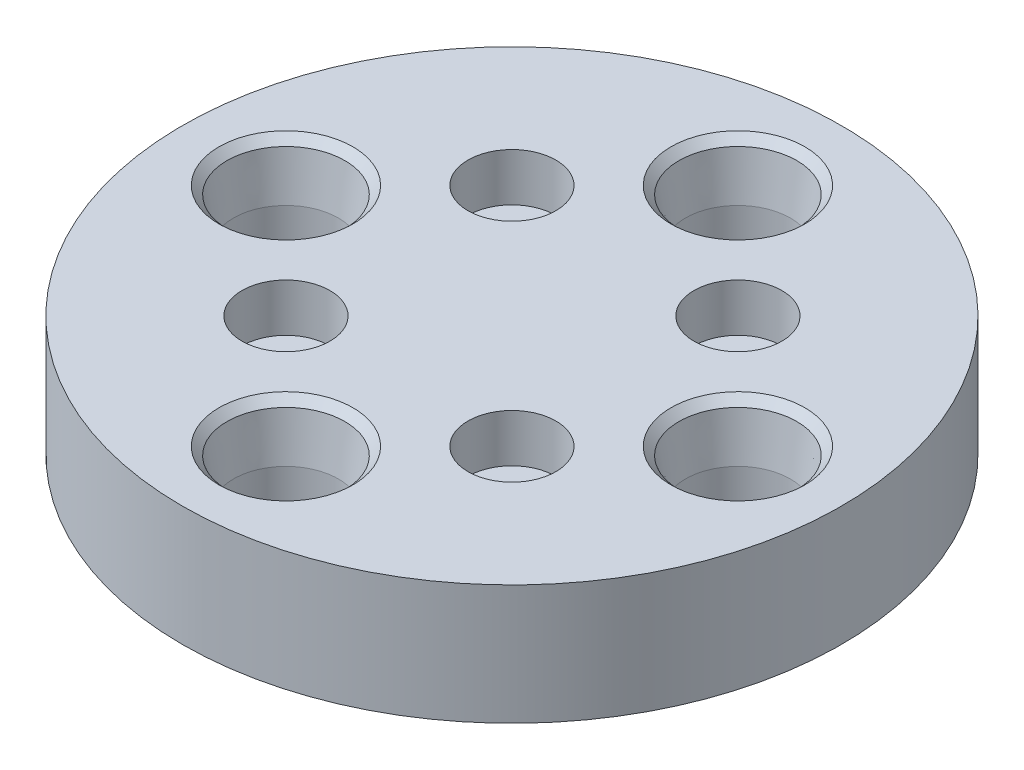
ISO-10303-21;
HEADER;
FILE_DESCRIPTION(('STEP AP214'),'2;1');
FILE_NAME('part.step','',(''),(''),'','','');
FILE_SCHEMA(('AUTOMOTIVE_DESIGN { 1 0 10303 214 1 1 1 1 }'));
ENDSEC;
DATA;
#1=APPLICATION_CONTEXT('core data for automotive mechanical design processes');
#2=APPLICATION_PROTOCOL_DEFINITION('international standard','automotive_design',2000,#1);
#3=PRODUCT_CONTEXT('',#1,'mechanical');
#4=PRODUCT('Part','Part','',(#3));
#5=PRODUCT_RELATED_PRODUCT_CATEGORY('part','',(#4));
#6=PRODUCT_DEFINITION_FORMATION('','',#4);
#7=PRODUCT_DEFINITION_CONTEXT('part definition',#1,'design');
#8=PRODUCT_DEFINITION('design','',#6,#7);
#9=PRODUCT_DEFINITION_SHAPE('','',#8);
#10=(LENGTH_UNIT() NAMED_UNIT(*) SI_UNIT(.MILLI.,.METRE.));
#11=(NAMED_UNIT(*) PLANE_ANGLE_UNIT() SI_UNIT($,.RADIAN.));
#12=(NAMED_UNIT(*) SI_UNIT($,.STERADIAN.) SOLID_ANGLE_UNIT());
#13=UNCERTAINTY_MEASURE_WITH_UNIT(LENGTH_MEASURE(1.E-05),#10,'distance_accuracy_value','');
#14=(GEOMETRIC_REPRESENTATION_CONTEXT(3) GLOBAL_UNCERTAINTY_ASSIGNED_CONTEXT((#13)) GLOBAL_UNIT_ASSIGNED_CONTEXT((#10,
#11,#12)) REPRESENTATION_CONTEXT('',''));
#15=CARTESIAN_POINT('',(0.,0.,0.));
#16=DIRECTION('',(0.,0.,1.));
#17=DIRECTION('',(1.,0.,0.));
#18=AXIS2_PLACEMENT_3D('',#15,#16,#17);
#19=CARTESIAN_POINT('',(0.,-8.,0.));
#20=DIRECTION('',(0.,-1.,0.));
#21=DIRECTION('',(0.,0.,-1.));
#22=AXIS2_PLACEMENT_3D('',#19,#20,#21);
#23=PLANE('',#22);
#24=CARTESIAN_POINT('',(0.,-8.,0.));
#25=DIRECTION('',(0.,-1.,0.));
#26=DIRECTION('',(0.,0.,-1.));
#27=AXIS2_PLACEMENT_3D('',#24,#25,#26);
#28=CIRCLE('',#27,4.5);
#29=CARTESIAN_POINT('',(0.,-8.,-4.5));
#30=VERTEX_POINT('',#29);
#31=EDGE_CURVE('E336',#30,#30,#28,.T.);
#32=ORIENTED_EDGE('',*,*,#31,.F.);
#33=EDGE_LOOP('',(#32));
#34=FACE_BOUND('',#33,.T.);
#35=CARTESIAN_POINT('',(5.65685424949243,-8.,5.65685424949233));
#36=DIRECTION('',(0.,1.,0.));
#37=DIRECTION('',(0.,0.,1.));
#38=AXIS2_PLACEMENT_3D('',#35,#36,#37);
#39=CIRCLE('',#38,1.2);
#40=CARTESIAN_POINT('',(5.65685424949243,-8.,6.85685424949233));
#41=VERTEX_POINT('',#40);
#42=EDGE_CURVE('E319',#41,#41,#39,.T.);
#43=ORIENTED_EDGE('',*,*,#42,.T.);
#44=EDGE_LOOP('',(#43));
#45=FACE_BOUND('',#44,.T.);
#46=CARTESIAN_POINT('',(5.65685424949239,-8.,-5.65685424949237));
#47=DIRECTION('',(0.,1.,0.));
#48=DIRECTION('',(0.,0.,1.));
#49=AXIS2_PLACEMENT_3D('',#46,#47,#48);
#50=CIRCLE('',#49,1.2);
#51=CARTESIAN_POINT('',(5.65685424949239,-8.,-4.45685424949237));
#52=VERTEX_POINT('',#51);
#53=EDGE_CURVE('E187',#52,#52,#50,.T.);
#54=ORIENTED_EDGE('',*,*,#53,.T.);
#55=EDGE_LOOP('',(#54));
#56=FACE_BOUND('',#55,.T.);
#57=CARTESIAN_POINT('',(-11.3137084989848,-8.,0.));
#58=DIRECTION('',(0.,-1.,0.));
#59=DIRECTION('',(0.,0.,-1.));
#60=AXIS2_PLACEMENT_3D('',#57,#58,#59);
#61=CIRCLE('',#60,2.25);
#62=CARTESIAN_POINT('',(-10.0762716319083,-8.,-1.87916204729658));
#63=VERTEX_POINT('',#62);
#64=CARTESIAN_POINT('',(-10.0762716319083,-8.,1.87916204729665));
#65=VERTEX_POINT('',#64);
#66=EDGE_CURVE('E11',#63,#65,#61,.T.);
#67=ORIENTED_EDGE('',*,*,#66,.F.);
#68=CARTESIAN_POINT('',(0.,-8.,0.));
#69=DIRECTION('',(0.,-1.,0.));
#70=DIRECTION('',(0.,0.,-1.));
#71=AXIS2_PLACEMENT_3D('',#68,#69,#70);
#72=CIRCLE('',#71,10.25);
#73=CARTESIAN_POINT('',(-1.87916204729661,-8.,-10.0762716319083));
#74=VERTEX_POINT('',#73);
#75=EDGE_CURVE('E141',#63,#74,#72,.T.);
#76=ORIENTED_EDGE('',*,*,#75,.T.);
#77=CARTESIAN_POINT('',(0.,-8.,-11.3137084989848));
#78=DIRECTION('',(0.,-1.,0.));
#79=DIRECTION('',(0.,0.,-1.));
#80=AXIS2_PLACEMENT_3D('',#77,#78,#79);
#81=CIRCLE('',#80,2.25);
#82=CARTESIAN_POINT('',(1.87916204729661,-8.,-10.0762716319083));
#83=VERTEX_POINT('',#82);
#84=EDGE_CURVE('E121',#83,#74,#81,.T.);
#85=ORIENTED_EDGE('',*,*,#84,.F.);
#86=CARTESIAN_POINT('',(10.0762716319083,-8.,-1.87916204729672));
#87=VERTEX_POINT('',#86);
#88=EDGE_CURVE('E128',#83,#87,#72,.T.);
#89=ORIENTED_EDGE('',*,*,#88,.T.);
#90=CARTESIAN_POINT('',(11.3137084989848,-8.,-1.18504806291949E-13));
#91=DIRECTION('',(0.,-1.,0.));
#92=DIRECTION('',(0.,0.,-1.));
#93=AXIS2_PLACEMENT_3D('',#90,#91,#92);
#94=CIRCLE('',#93,2.25);
#95=CARTESIAN_POINT('',(10.0762716319083,-8.,1.87916204729651));
#96=VERTEX_POINT('',#95);
#97=EDGE_CURVE('E109',#96,#87,#94,.T.);
#98=ORIENTED_EDGE('',*,*,#97,.F.);
#99=CARTESIAN_POINT('',(1.87916204729661,-8.,10.0762716319083));
#100=VERTEX_POINT('',#99);
#101=EDGE_CURVE('E139',#96,#100,#72,.T.);
#102=ORIENTED_EDGE('',*,*,#101,.T.);
#103=CARTESIAN_POINT('',(0.,-8.,11.3137084989848));
#104=DIRECTION('',(0.,-1.,0.));
#105=DIRECTION('',(0.,0.,-1.));
#106=AXIS2_PLACEMENT_3D('',#103,#104,#105);
#107=CIRCLE('',#106,2.25);
#108=CARTESIAN_POINT('',(-1.87916204729661,-8.,10.0762716319083));
#109=VERTEX_POINT('',#108);
#110=EDGE_CURVE('E54',#109,#100,#107,.T.);
#111=ORIENTED_EDGE('',*,*,#110,.F.);
#112=EDGE_CURVE('E147',#109,#65,#72,.T.);
#113=ORIENTED_EDGE('',*,*,#112,.T.);
#114=EDGE_LOOP('',(#67,#76,#85,#89,#98,#102,#111,#113));
#115=FACE_BOUND('',#114,.T.);
#116=CARTESIAN_POINT('',(-5.65685424949239,-8.,-5.65685424949237));
#117=DIRECTION('',(0.,1.,0.));
#118=DIRECTION('',(0.,0.,1.));
#119=AXIS2_PLACEMENT_3D('',#116,#117,#118);
#120=CIRCLE('',#119,1.2);
#121=CARTESIAN_POINT('',(-5.65685424949239,-8.,-4.45685424949237));
#122=VERTEX_POINT('',#121);
#123=EDGE_CURVE('E287',#122,#122,#120,.T.);
#124=ORIENTED_EDGE('',*,*,#123,.T.);
#125=EDGE_LOOP('',(#124));
#126=FACE_BOUND('',#125,.T.);
#127=CARTESIAN_POINT('',(-5.65685424949239,-8.,5.65685424949237));
#128=DIRECTION('',(0.,1.,0.));
#129=DIRECTION('',(0.,0.,1.));
#130=AXIS2_PLACEMENT_3D('',#127,#128,#129);
#131=CIRCLE('',#130,1.2);
#132=CARTESIAN_POINT('',(-5.65685424949239,-8.,6.85685424949237));
#133=VERTEX_POINT('',#132);
#134=EDGE_CURVE('E303',#133,#133,#131,.T.);
#135=ORIENTED_EDGE('',*,*,#134,.T.);
#136=EDGE_LOOP('',(#135));
#137=FACE_BOUND('',#136,.T.);
#138=ADVANCED_FACE('F45',(#34,#45,#56,#115,#126,#137),#23,.T.);
#139=CARTESIAN_POINT('',(0.,-8.,0.));
#140=DIRECTION('',(0.,1.,0.));
#141=DIRECTION('',(0.,0.,1.));
#142=AXIS2_PLACEMENT_3D('',#139,#140,#141);
#143=CYLINDRICAL_SURFACE('',#142,10.25);
#144=CARTESIAN_POINT('',(0.,-6.,0.));
#145=DIRECTION('',(0.,-1.,0.));
#146=DIRECTION('',(0.,0.,-1.));
#147=AXIS2_PLACEMENT_3D('',#144,#145,#146);
#148=CIRCLE('',#147,10.25);
#149=CARTESIAN_POINT('',(-1.87916204729662,-6.,10.0762716319083));
#150=VERTEX_POINT('',#149);
#151=CARTESIAN_POINT('',(-10.0762716319083,-6.,1.87916204729665));
#152=VERTEX_POINT('',#151);
#153=EDGE_CURVE('E407',#150,#152,#148,.T.);
#154=ORIENTED_EDGE('',*,*,#153,.T.);
#155=DIRECTION('',(0.,1.,0.));
#156=VECTOR('',#155,1.);
#157=CARTESIAN_POINT('',(-10.0762716319083,-4.,1.87916204729665));
#158=LINE('',#157,#156);
#159=EDGE_CURVE('E203',#152,#65,#158,.F.);
#160=ORIENTED_EDGE('',*,*,#159,.T.);
#161=ORIENTED_EDGE('',*,*,#112,.F.);
#162=DIRECTION('',(0.,1.,0.));
#163=VECTOR('',#162,1.);
#164=CARTESIAN_POINT('',(-1.87916204729661,-4.,10.0762716319083));
#165=LINE('',#164,#163);
#166=EDGE_CURVE('E68',#109,#150,#165,.T.);
#167=ORIENTED_EDGE('',*,*,#166,.T.);
#168=EDGE_LOOP('',(#154,#160,#161,#167));
#169=FACE_BOUND('',#168,.T.);
#170=ADVANCED_FACE('F355',(#169),#143,.T.);
#171=CARTESIAN_POINT('',(10.0762716319083,-6.,1.87916204729651));
#172=VERTEX_POINT('',#171);
#173=CARTESIAN_POINT('',(1.87916204729661,-6.,10.0762716319083));
#174=VERTEX_POINT('',#173);
#175=EDGE_CURVE('E416',#172,#174,#148,.T.);
#176=ORIENTED_EDGE('',*,*,#175,.T.);
#177=DIRECTION('',(0.,1.,0.));
#178=VECTOR('',#177,1.);
#179=CARTESIAN_POINT('',(1.87916204729661,-4.,10.0762716319083));
#180=LINE('',#179,#178);
#181=EDGE_CURVE('E213',#174,#100,#180,.F.);
#182=ORIENTED_EDGE('',*,*,#181,.T.);
#183=ORIENTED_EDGE('',*,*,#101,.F.);
#184=DIRECTION('',(0.,1.,0.));
#185=VECTOR('',#184,1.);
#186=CARTESIAN_POINT('',(10.0762716319083,-4.,1.87916204729651));
#187=LINE('',#186,#185);
#188=EDGE_CURVE('E115',#96,#172,#187,.T.);
#189=ORIENTED_EDGE('',*,*,#188,.T.);
#190=EDGE_LOOP('',(#176,#182,#183,#189));
#191=FACE_BOUND('',#190,.T.);
#192=ADVANCED_FACE('F398',(#191),#143,.T.);
#193=CARTESIAN_POINT('',(1.87916204729661,-6.,-10.0762716319083));
#194=VERTEX_POINT('',#193);
#195=CARTESIAN_POINT('',(10.0762716319083,-6.,-1.87916204729672));
#196=VERTEX_POINT('',#195);
#197=EDGE_CURVE('E130',#194,#196,#148,.T.);
#198=ORIENTED_EDGE('',*,*,#197,.T.);
#199=DIRECTION('',(0.,1.,0.));
#200=VECTOR('',#199,1.);
#201=CARTESIAN_POINT('',(10.0762716319083,-4.,-1.87916204729672));
#202=LINE('',#201,#200);
#203=EDGE_CURVE('E112',#196,#87,#202,.F.);
#204=ORIENTED_EDGE('',*,*,#203,.T.);
#205=ORIENTED_EDGE('',*,*,#88,.F.);
#206=DIRECTION('',(0.,1.,0.));
#207=VECTOR('',#206,1.);
#208=CARTESIAN_POINT('',(1.87916204729661,-4.,-10.0762716319083));
#209=LINE('',#208,#207);
#210=EDGE_CURVE('E162',#83,#194,#209,.T.);
#211=ORIENTED_EDGE('',*,*,#210,.T.);
#212=EDGE_LOOP('',(#198,#204,#205,#211));
#213=FACE_BOUND('',#212,.T.);
#214=ADVANCED_FACE('F126',(#213),#143,.T.);
#215=CARTESIAN_POINT('',(0.,-6.,0.));
#216=DIRECTION('',(0.,1.,0.));
#217=DIRECTION('',(0.,0.,1.));
#218=AXIS2_PLACEMENT_3D('',#215,#216,#217);
#219=CYLINDRICAL_SURFACE('',#218,16.5);
#220=CARTESIAN_POINT('',(0.,-6.,0.));
#221=DIRECTION('',(0.,1.,0.));
#222=DIRECTION('',(0.,0.,1.));
#223=AXIS2_PLACEMENT_3D('',#220,#221,#222);
#224=CIRCLE('',#223,16.5);
#225=CARTESIAN_POINT('',(0.,-6.,16.5));
#226=VERTEX_POINT('',#225);
#227=EDGE_CURVE('E145',#226,#226,#224,.T.);
#228=ORIENTED_EDGE('',*,*,#227,.T.);
#229=EDGE_LOOP('',(#228));
#230=FACE_BOUND('',#229,.T.);
#231=CARTESIAN_POINT('',(0.,0.,0.));
#232=DIRECTION('',(0.,1.,0.));
#233=DIRECTION('',(0.,0.,1.));
#234=AXIS2_PLACEMENT_3D('',#231,#232,#233);
#235=CIRCLE('',#234,16.5);
#236=CARTESIAN_POINT('',(0.,0.,16.5));
#237=VERTEX_POINT('',#236);
#238=EDGE_CURVE('E138',#237,#237,#235,.T.);
#239=ORIENTED_EDGE('',*,*,#238,.F.);
#240=EDGE_LOOP('',(#239));
#241=FACE_BOUND('',#240,.T.);
#242=ADVANCED_FACE('F47',(#230,#241),#219,.T.);
#243=CARTESIAN_POINT('',(0.,-6.,0.));
#244=DIRECTION('',(0.,1.,0.));
#245=DIRECTION('',(0.,0.,1.));
#246=AXIS2_PLACEMENT_3D('',#243,#244,#245);
#247=PLANE('',#246);
#248=CARTESIAN_POINT('',(-10.0762716319083,-6.,-1.87916204729658));
#249=VERTEX_POINT('',#248);
#250=CARTESIAN_POINT('',(-1.87916204729661,-6.,-10.0762716319083));
#251=VERTEX_POINT('',#250);
#252=EDGE_CURVE('E404',#249,#251,#148,.T.);
#253=ORIENTED_EDGE('',*,*,#252,.F.);
#254=CARTESIAN_POINT('',(-11.3137084989848,-6.,0.));
#255=DIRECTION('',(0.,1.,0.));
#256=DIRECTION('',(0.,0.,1.));
#257=AXIS2_PLACEMENT_3D('',#254,#255,#256);
#258=CIRCLE('',#257,2.25);
#259=EDGE_CURVE('E207',#249,#152,#258,.T.);
#260=ORIENTED_EDGE('',*,*,#259,.T.);
#261=ORIENTED_EDGE('',*,*,#153,.F.);
#262=CARTESIAN_POINT('',(0.,-6.,11.3137084989848));
#263=DIRECTION('',(0.,1.,0.));
#264=DIRECTION('',(0.,0.,1.));
#265=AXIS2_PLACEMENT_3D('',#262,#263,#264);
#266=CIRCLE('',#265,2.25);
#267=EDGE_CURVE('E217',#150,#174,#266,.T.);
#268=ORIENTED_EDGE('',*,*,#267,.T.);
#269=ORIENTED_EDGE('',*,*,#175,.F.);
#270=CARTESIAN_POINT('',(11.3137084989848,-6.,-1.18504806291949E-13));
#271=DIRECTION('',(0.,1.,0.));
#272=DIRECTION('',(0.,0.,1.));
#273=AXIS2_PLACEMENT_3D('',#270,#271,#272);
#274=CIRCLE('',#273,2.25);
#275=EDGE_CURVE('E132',#172,#196,#274,.T.);
#276=ORIENTED_EDGE('',*,*,#275,.T.);
#277=ORIENTED_EDGE('',*,*,#197,.F.);
#278=CARTESIAN_POINT('',(0.,-6.,-11.3137084989848));
#279=DIRECTION('',(0.,1.,0.));
#280=DIRECTION('',(0.,0.,1.));
#281=AXIS2_PLACEMENT_3D('',#278,#279,#280);
#282=CIRCLE('',#281,2.25);
#283=EDGE_CURVE('E157',#194,#251,#282,.T.);
#284=ORIENTED_EDGE('',*,*,#283,.T.);
#285=EDGE_LOOP('',(#253,#260,#261,#268,#269,#276,#277,#284));
#286=FACE_BOUND('',#285,.T.);
#287=ORIENTED_EDGE('',*,*,#227,.F.);
#288=EDGE_LOOP('',(#287));
#289=FACE_BOUND('',#288,.T.);
#290=ADVANCED_FACE('F384',(#286,#289),#247,.F.);
#291=CARTESIAN_POINT('',(0.,0.,0.));
#292=DIRECTION('',(0.,1.,0.));
#293=DIRECTION('',(0.,0.,1.));
#294=AXIS2_PLACEMENT_3D('',#291,#292,#293);
#295=PLANE('',#294);
#296=CARTESIAN_POINT('',(5.65685424949243,0.,5.65685424949233));
#297=DIRECTION('',(0.,1.,0.));
#298=DIRECTION('',(0.,0.,1.));
#299=AXIS2_PLACEMENT_3D('',#296,#297,#298);
#300=CIRCLE('',#299,2.2);
#301=CARTESIAN_POINT('',(5.65685424949243,0.,7.85685424949233));
#302=VERTEX_POINT('',#301);
#303=EDGE_CURVE('E331',#302,#302,#300,.T.);
#304=ORIENTED_EDGE('',*,*,#303,.F.);
#305=EDGE_LOOP('',(#304));
#306=FACE_BOUND('',#305,.T.);
#307=CARTESIAN_POINT('',(-5.65685424949239,0.,5.65685424949237));
#308=DIRECTION('',(0.,1.,0.));
#309=DIRECTION('',(0.,0.,1.));
#310=AXIS2_PLACEMENT_3D('',#307,#308,#309);
#311=CIRCLE('',#310,2.2);
#312=CARTESIAN_POINT('',(-5.65685424949239,0.,7.85685424949237));
#313=VERTEX_POINT('',#312);
#314=EDGE_CURVE('E315',#313,#313,#311,.T.);
#315=ORIENTED_EDGE('',*,*,#314,.F.);
#316=EDGE_LOOP('',(#315));
#317=FACE_BOUND('',#316,.T.);
#318=CARTESIAN_POINT('',(-5.65685424949239,0.,-5.65685424949237));
#319=DIRECTION('',(0.,1.,0.));
#320=DIRECTION('',(0.,0.,1.));
#321=AXIS2_PLACEMENT_3D('',#318,#319,#320);
#322=CIRCLE('',#321,2.2);
#323=CARTESIAN_POINT('',(-5.65685424949239,0.,-3.45685424949237));
#324=VERTEX_POINT('',#323);
#325=EDGE_CURVE('E299',#324,#324,#322,.T.);
#326=ORIENTED_EDGE('',*,*,#325,.F.);
#327=EDGE_LOOP('',(#326));
#328=FACE_BOUND('',#327,.T.);
#329=CARTESIAN_POINT('',(11.3137084989848,0.,-1.18504806291949E-13));
#330=DIRECTION('',(0.,-1.,0.));
#331=DIRECTION('',(1.,0.,0.));
#332=AXIS2_PLACEMENT_3D('',#329,#330,#331);
#333=CIRCLE('',#332,3.35175744068304);
#334=CARTESIAN_POINT('',(14.6654659396678,0.,-1.53612601961369E-13));
#335=VERTEX_POINT('',#334);
#336=EDGE_CURVE('E267',#335,#335,#333,.T.);
#337=ORIENTED_EDGE('',*,*,#336,.T.);
#338=EDGE_LOOP('',(#337));
#339=FACE_BOUND('',#338,.T.);
#340=CARTESIAN_POINT('',(0.,0.,11.3137084989848));
#341=DIRECTION('',(0.,-1.,0.));
#342=DIRECTION('',(0.,0.,1.));
#343=AXIS2_PLACEMENT_3D('',#340,#341,#342);
#344=CIRCLE('',#343,3.35175744068304);
#345=CARTESIAN_POINT('',(0.,0.,14.6654659396678));
#346=VERTEX_POINT('',#345);
#347=EDGE_CURVE('E247',#346,#346,#344,.T.);
#348=ORIENTED_EDGE('',*,*,#347,.T.);
#349=EDGE_LOOP('',(#348));
#350=FACE_BOUND('',#349,.T.);
#351=CARTESIAN_POINT('',(-11.3137084989848,0.,0.));
#352=DIRECTION('',(0.,-1.,0.));
#353=DIRECTION('',(-1.,0.,0.));
#354=AXIS2_PLACEMENT_3D('',#351,#352,#353);
#355=CIRCLE('',#354,3.35175744068304);
#356=CARTESIAN_POINT('',(-14.6654659396678,0.,0.));
#357=VERTEX_POINT('',#356);
#358=EDGE_CURVE('E227',#357,#357,#355,.T.);
#359=ORIENTED_EDGE('',*,*,#358,.T.);
#360=EDGE_LOOP('',(#359));
#361=FACE_BOUND('',#360,.T.);
#362=CARTESIAN_POINT('',(5.65685424949239,0.,-5.65685424949237));
#363=DIRECTION('',(0.,1.,0.));
#364=DIRECTION('',(0.,0.,1.));
#365=AXIS2_PLACEMENT_3D('',#362,#363,#364);
#366=CIRCLE('',#365,2.2);
#367=CARTESIAN_POINT('',(5.65685424949239,0.,-3.45685424949237));
#368=VERTEX_POINT('',#367);
#369=EDGE_CURVE('E199',#368,#368,#366,.T.);
#370=ORIENTED_EDGE('',*,*,#369,.F.);
#371=EDGE_LOOP('',(#370));
#372=FACE_BOUND('',#371,.T.);
#373=CARTESIAN_POINT('',(0.,0.,-11.3137084989848));
#374=DIRECTION('',(0.,-1.,0.));
#375=DIRECTION('',(0.,0.,-1.));
#376=AXIS2_PLACEMENT_3D('',#373,#374,#375);
#377=CIRCLE('',#376,3.35175744068304);
#378=CARTESIAN_POINT('',(0.,0.,-14.6654659396678));
#379=VERTEX_POINT('',#378);
#380=EDGE_CURVE('E167',#379,#379,#377,.T.);
#381=ORIENTED_EDGE('',*,*,#380,.T.);
#382=EDGE_LOOP('',(#381));
#383=FACE_BOUND('',#382,.T.);
#384=ORIENTED_EDGE('',*,*,#238,.T.);
#385=EDGE_LOOP('',(#384));
#386=FACE_BOUND('',#385,.T.);
#387=ADVANCED_FACE('F380',(#306,#317,#328,#339,#350,#361,#372,#383,#386),#295,.T.);
#388=ORIENTED_EDGE('',*,*,#75,.F.);
#389=DIRECTION('',(0.,1.,0.));
#390=VECTOR('',#389,1.);
#391=CARTESIAN_POINT('',(-10.0762716319083,-4.,-1.87916204729658));
#392=LINE('',#391,#390);
#393=EDGE_CURVE('E60',#63,#249,#392,.T.);
#394=ORIENTED_EDGE('',*,*,#393,.T.);
#395=ORIENTED_EDGE('',*,*,#252,.T.);
#396=DIRECTION('',(0.,1.,0.));
#397=VECTOR('',#396,1.);
#398=CARTESIAN_POINT('',(-1.87916204729661,-4.,-10.0762716319083));
#399=LINE('',#398,#397);
#400=EDGE_CURVE('E151',#251,#74,#399,.F.);
#401=ORIENTED_EDGE('',*,*,#400,.T.);
#402=EDGE_LOOP('',(#388,#394,#395,#401));
#403=FACE_BOUND('',#402,.T.);
#404=ADVANCED_FACE('F383',(#403),#143,.T.);
#405=CARTESIAN_POINT('',(0.,-8.,-11.3137084989848));
#406=DIRECTION('',(0.,1.,0.));
#407=DIRECTION('',(0.,0.,1.));
#408=AXIS2_PLACEMENT_3D('',#405,#406,#407);
#409=CYLINDRICAL_SURFACE('',#408,2.25);
#410=CARTESIAN_POINT('',(0.,-5.825,-11.3137084989848));
#411=DIRECTION('',(0.,-1.,0.));
#412=DIRECTION('',(0.,0.,-1.));
#413=AXIS2_PLACEMENT_3D('',#410,#411,#412);
#414=CIRCLE('',#413,2.25);
#415=CARTESIAN_POINT('',(0.,-5.825,-13.5637084989848));
#416=VERTEX_POINT('',#415);
#417=EDGE_CURVE('E183',#416,#416,#414,.T.);
#418=ORIENTED_EDGE('',*,*,#417,.F.);
#419=EDGE_LOOP('',(#418));
#420=FACE_BOUND('',#419,.T.);
#421=ORIENTED_EDGE('',*,*,#283,.F.);
#422=ORIENTED_EDGE('',*,*,#210,.F.);
#423=ORIENTED_EDGE('',*,*,#84,.T.);
#424=ORIENTED_EDGE('',*,*,#400,.F.);
#425=EDGE_LOOP('',(#421,#422,#423,#424));
#426=FACE_BOUND('',#425,.T.);
#427=ADVANCED_FACE('F426',(#420,#426),#409,.F.);
#428=CARTESIAN_POINT('',(0.,-0.4,-11.3137084989848));
#429=DIRECTION('',(0.,1.,0.));
#430=DIRECTION('',(0.,0.,1.));
#431=AXIS2_PLACEMENT_3D('',#428,#429,#430);
#432=CONICAL_SURFACE('',#431,2.95175744068304,0.785398163397445);
#433=ORIENTED_EDGE('',*,*,#380,.F.);
#434=EDGE_LOOP('',(#433));
#435=FACE_BOUND('',#434,.T.);
#436=CARTESIAN_POINT('',(0.,-0.4,-11.3137084989848));
#437=DIRECTION('',(0.,-1.,0.));
#438=DIRECTION('',(0.,0.,-1.));
#439=AXIS2_PLACEMENT_3D('',#436,#437,#438);
#440=CIRCLE('',#439,2.95175744068304);
#441=CARTESIAN_POINT('',(0.,-0.4,-14.2654659396678));
#442=VERTEX_POINT('',#441);
#443=EDGE_CURVE('E171',#442,#442,#440,.T.);
#444=ORIENTED_EDGE('',*,*,#443,.T.);
#445=EDGE_LOOP('',(#444));
#446=FACE_BOUND('',#445,.T.);
#447=ADVANCED_FACE('F428',(#435,#446),#432,.F.);
#448=CARTESIAN_POINT('',(0.,-2.725,-11.3137084989848));
#449=DIRECTION('',(0.,1.,0.));
#450=DIRECTION('',(0.,0.,1.));
#451=AXIS2_PLACEMENT_3D('',#448,#449,#450);
#452=CONICAL_SURFACE('',#451,2.625,0.13962634015954);
#453=ORIENTED_EDGE('',*,*,#443,.F.);
#454=EDGE_LOOP('',(#453));
#455=FACE_BOUND('',#454,.T.);
#456=CARTESIAN_POINT('',(0.,-2.725,-11.3137084989848));
#457=DIRECTION('',(0.,-1.,0.));
#458=DIRECTION('',(0.,0.,-1.));
#459=AXIS2_PLACEMENT_3D('',#456,#457,#458);
#460=CIRCLE('',#459,2.625);
#461=CARTESIAN_POINT('',(0.,-2.725,-13.9387084989848));
#462=VERTEX_POINT('',#461);
#463=EDGE_CURVE('E175',#462,#462,#460,.T.);
#464=ORIENTED_EDGE('',*,*,#463,.T.);
#465=EDGE_LOOP('',(#464));
#466=FACE_BOUND('',#465,.T.);
#467=ADVANCED_FACE('F435',(#455,#466),#452,.F.);
#468=CARTESIAN_POINT('',(0.,-5.825,-11.3137084989848));
#469=DIRECTION('',(0.,-1.,0.));
#470=DIRECTION('',(0.,0.,-1.));
#471=AXIS2_PLACEMENT_3D('',#468,#469,#470);
#472=CYLINDRICAL_SURFACE('',#471,2.625);
#473=ORIENTED_EDGE('',*,*,#463,.F.);
#474=EDGE_LOOP('',(#473));
#475=FACE_BOUND('',#474,.T.);
#476=CARTESIAN_POINT('',(0.,-5.45,-11.3137084989848));
#477=DIRECTION('',(0.,-1.,0.));
#478=DIRECTION('',(0.,0.,-1.));
#479=AXIS2_PLACEMENT_3D('',#476,#477,#478);
#480=CIRCLE('',#479,2.625);
#481=CARTESIAN_POINT('',(0.,-5.45,-13.9387084989848));
#482=VERTEX_POINT('',#481);
#483=EDGE_CURVE('E179',#482,#482,#480,.T.);
#484=ORIENTED_EDGE('',*,*,#483,.T.);
#485=EDGE_LOOP('',(#484));
#486=FACE_BOUND('',#485,.T.);
#487=ADVANCED_FACE('F442',(#475,#486),#472,.F.);
#488=CARTESIAN_POINT('',(0.,-5.825,-11.3137084989848));
#489=DIRECTION('',(0.,1.,0.));
#490=DIRECTION('',(0.,0.,1.));
#491=AXIS2_PLACEMENT_3D('',#488,#489,#490);
#492=CONICAL_SURFACE('',#491,2.25,0.785398163397446);
#493=ORIENTED_EDGE('',*,*,#483,.F.);
#494=EDGE_LOOP('',(#493));
#495=FACE_BOUND('',#494,.T.);
#496=ORIENTED_EDGE('',*,*,#417,.T.);
#497=EDGE_LOOP('',(#496));
#498=FACE_BOUND('',#497,.T.);
#499=ADVANCED_FACE('F365',(#495,#498),#492,.F.);
#500=CARTESIAN_POINT('',(5.65685424949239,0.,-5.65685424949237));
#501=DIRECTION('',(0.,1.,0.));
#502=DIRECTION('',(0.,0.,1.));
#503=AXIS2_PLACEMENT_3D('',#500,#501,#502);
#504=CYLINDRICAL_SURFACE('',#503,1.2);
#505=ORIENTED_EDGE('',*,*,#53,.F.);
#506=EDGE_LOOP('',(#505));
#507=FACE_BOUND('',#506,.T.);
#508=CARTESIAN_POINT('',(5.65685424949239,-2.4,-5.65685424949237));
#509=DIRECTION('',(0.,1.,0.));
#510=DIRECTION('',(0.,0.,1.));
#511=AXIS2_PLACEMENT_3D('',#508,#509,#510);
#512=CIRCLE('',#511,1.2);
#513=CARTESIAN_POINT('',(5.65685424949239,-2.4,-4.45685424949237));
#514=VERTEX_POINT('',#513);
#515=EDGE_CURVE('E191',#514,#514,#512,.T.);
#516=ORIENTED_EDGE('',*,*,#515,.T.);
#517=EDGE_LOOP('',(#516));
#518=FACE_BOUND('',#517,.T.);
#519=ADVANCED_FACE('F361',(#507,#518),#504,.F.);
#520=CARTESIAN_POINT('',(6.85685424949239,-2.4,-5.65685424949237));
#521=DIRECTION('',(0.,-1.,0.));
#522=DIRECTION('',(0.,0.,-1.));
#523=AXIS2_PLACEMENT_3D('',#520,#521,#522);
#524=PLANE('',#523);
#525=ORIENTED_EDGE('',*,*,#515,.F.);
#526=EDGE_LOOP('',(#525));
#527=FACE_BOUND('',#526,.T.);
#528=CARTESIAN_POINT('',(5.65685424949239,-2.4,-5.65685424949237));
#529=DIRECTION('',(0.,1.,0.));
#530=DIRECTION('',(0.,0.,1.));
#531=AXIS2_PLACEMENT_3D('',#528,#529,#530);
#532=CIRCLE('',#531,2.2);
#533=CARTESIAN_POINT('',(5.65685424949239,-2.4,-3.45685424949237));
#534=VERTEX_POINT('',#533);
#535=EDGE_CURVE('E195',#534,#534,#532,.T.);
#536=ORIENTED_EDGE('',*,*,#535,.T.);
#537=EDGE_LOOP('',(#536));
#538=FACE_BOUND('',#537,.T.);
#539=ADVANCED_FACE('F364',(#527,#538),#524,.F.);
#540=CARTESIAN_POINT('',(5.65685424949239,0.,-5.65685424949237));
#541=DIRECTION('',(0.,1.,0.));
#542=DIRECTION('',(0.,0.,1.));
#543=AXIS2_PLACEMENT_3D('',#540,#541,#542);
#544=CYLINDRICAL_SURFACE('',#543,2.2);
#545=ORIENTED_EDGE('',*,*,#535,.F.);
#546=EDGE_LOOP('',(#545));
#547=FACE_BOUND('',#546,.T.);
#548=ORIENTED_EDGE('',*,*,#369,.T.);
#549=EDGE_LOOP('',(#548));
#550=FACE_BOUND('',#549,.T.);
#551=ADVANCED_FACE('F371',(#547,#550),#544,.F.);
#552=CARTESIAN_POINT('',(11.3137084989848,-8.,-1.18504806291949E-13));
#553=DIRECTION('',(0.,1.,0.));
#554=DIRECTION('',(0.,0.,1.));
#555=AXIS2_PLACEMENT_3D('',#552,#553,#554);
#556=CYLINDRICAL_SURFACE('',#555,2.25);
#557=CARTESIAN_POINT('',(11.3137084989848,-5.825,-1.18504806291949E-13));
#558=DIRECTION('',(0.,-1.,0.));
#559=DIRECTION('',(1.,0.,0.));
#560=AXIS2_PLACEMENT_3D('',#557,#558,#559);
#561=CIRCLE('',#560,2.25);
#562=CARTESIAN_POINT('',(13.5637084989848,-5.825,-1.4207230532914E-13));
#563=VERTEX_POINT('',#562);
#564=EDGE_CURVE('E283',#563,#563,#561,.T.);
#565=ORIENTED_EDGE('',*,*,#564,.F.);
#566=EDGE_LOOP('',(#565));
#567=FACE_BOUND('',#566,.T.);
#568=ORIENTED_EDGE('',*,*,#275,.F.);
#569=ORIENTED_EDGE('',*,*,#188,.F.);
#570=ORIENTED_EDGE('',*,*,#97,.T.);
#571=ORIENTED_EDGE('',*,*,#203,.F.);
#572=EDGE_LOOP('',(#568,#569,#570,#571));
#573=FACE_BOUND('',#572,.T.);
#574=ADVANCED_FACE('F111',(#567,#573),#556,.F.);
#575=CARTESIAN_POINT('',(0.,-8.,11.3137084989848));
#576=DIRECTION('',(0.,1.,0.));
#577=DIRECTION('',(0.,0.,1.));
#578=AXIS2_PLACEMENT_3D('',#575,#576,#577);
#579=CYLINDRICAL_SURFACE('',#578,2.25);
#580=CARTESIAN_POINT('',(0.,-5.825,11.3137084989848));
#581=DIRECTION('',(0.,-1.,0.));
#582=DIRECTION('',(0.,0.,1.));
#583=AXIS2_PLACEMENT_3D('',#580,#581,#582);
#584=CIRCLE('',#583,2.25);
#585=CARTESIAN_POINT('',(0.,-5.825,13.5637084989848));
#586=VERTEX_POINT('',#585);
#587=EDGE_CURVE('E263',#586,#586,#584,.T.);
#588=ORIENTED_EDGE('',*,*,#587,.F.);
#589=EDGE_LOOP('',(#588));
#590=FACE_BOUND('',#589,.T.);
#591=ORIENTED_EDGE('',*,*,#267,.F.);
#592=ORIENTED_EDGE('',*,*,#166,.F.);
#593=ORIENTED_EDGE('',*,*,#110,.T.);
#594=ORIENTED_EDGE('',*,*,#181,.F.);
#595=EDGE_LOOP('',(#591,#592,#593,#594));
#596=FACE_BOUND('',#595,.T.);
#597=ADVANCED_FACE('F411',(#590,#596),#579,.F.);
#598=CARTESIAN_POINT('',(-11.3137084989848,-8.,0.));
#599=DIRECTION('',(0.,1.,0.));
#600=DIRECTION('',(0.,0.,1.));
#601=AXIS2_PLACEMENT_3D('',#598,#599,#600);
#602=CYLINDRICAL_SURFACE('',#601,2.25);
#603=CARTESIAN_POINT('',(-11.3137084989848,-5.825,0.));
#604=DIRECTION('',(0.,-1.,0.));
#605=DIRECTION('',(-1.,0.,0.));
#606=AXIS2_PLACEMENT_3D('',#603,#604,#605);
#607=CIRCLE('',#606,2.25);
#608=CARTESIAN_POINT('',(-13.5637084989848,-5.825,0.));
#609=VERTEX_POINT('',#608);
#610=EDGE_CURVE('E243',#609,#609,#607,.T.);
#611=ORIENTED_EDGE('',*,*,#610,.F.);
#612=EDGE_LOOP('',(#611));
#613=FACE_BOUND('',#612,.T.);
#614=ORIENTED_EDGE('',*,*,#259,.F.);
#615=ORIENTED_EDGE('',*,*,#393,.F.);
#616=ORIENTED_EDGE('',*,*,#66,.T.);
#617=ORIENTED_EDGE('',*,*,#159,.F.);
#618=EDGE_LOOP('',(#614,#615,#616,#617));
#619=FACE_BOUND('',#618,.T.);
#620=ADVANCED_FACE('F424',(#613,#619),#602,.F.);
#621=CARTESIAN_POINT('',(-11.3137084989848,-0.4,0.));
#622=DIRECTION('',(0.,1.,0.));
#623=DIRECTION('',(1.,0.,0.));
#624=AXIS2_PLACEMENT_3D('',#621,#622,#623);
#625=CONICAL_SURFACE('',#624,2.95175744068304,0.785398163397445);
#626=ORIENTED_EDGE('',*,*,#358,.F.);
#627=EDGE_LOOP('',(#626));
#628=FACE_BOUND('',#627,.T.);
#629=CARTESIAN_POINT('',(-11.3137084989848,-0.4,0.));
#630=DIRECTION('',(0.,-1.,0.));
#631=DIRECTION('',(-1.,0.,0.));
#632=AXIS2_PLACEMENT_3D('',#629,#630,#631);
#633=CIRCLE('',#632,2.95175744068304);
#634=CARTESIAN_POINT('',(-14.2654659396678,-0.4,0.));
#635=VERTEX_POINT('',#634);
#636=EDGE_CURVE('E231',#635,#635,#633,.T.);
#637=ORIENTED_EDGE('',*,*,#636,.T.);
#638=EDGE_LOOP('',(#637));
#639=FACE_BOUND('',#638,.T.);
#640=ADVANCED_FACE('F458',(#628,#639),#625,.F.);
#641=CARTESIAN_POINT('',(-11.3137084989848,-2.725,0.));
#642=DIRECTION('',(0.,1.,0.));
#643=DIRECTION('',(1.,0.,0.));
#644=AXIS2_PLACEMENT_3D('',#641,#642,#643);
#645=CONICAL_SURFACE('',#644,2.625,0.13962634015954);
#646=ORIENTED_EDGE('',*,*,#636,.F.);
#647=EDGE_LOOP('',(#646));
#648=FACE_BOUND('',#647,.T.);
#649=CARTESIAN_POINT('',(-11.3137084989848,-2.725,0.));
#650=DIRECTION('',(0.,-1.,0.));
#651=DIRECTION('',(-1.,0.,0.));
#652=AXIS2_PLACEMENT_3D('',#649,#650,#651);
#653=CIRCLE('',#652,2.625);
#654=CARTESIAN_POINT('',(-13.9387084989848,-2.725,0.));
#655=VERTEX_POINT('',#654);
#656=EDGE_CURVE('E235',#655,#655,#653,.T.);
#657=ORIENTED_EDGE('',*,*,#656,.T.);
#658=EDGE_LOOP('',(#657));
#659=FACE_BOUND('',#658,.T.);
#660=ADVANCED_FACE('F462',(#648,#659),#645,.F.);
#661=CARTESIAN_POINT('',(-11.3137084989848,-5.825,0.));
#662=DIRECTION('',(0.,-1.,0.));
#663=DIRECTION('',(-1.,0.,0.));
#664=AXIS2_PLACEMENT_3D('',#661,#662,#663);
#665=CYLINDRICAL_SURFACE('',#664,2.625);
#666=ORIENTED_EDGE('',*,*,#656,.F.);
#667=EDGE_LOOP('',(#666));
#668=FACE_BOUND('',#667,.T.);
#669=CARTESIAN_POINT('',(-11.3137084989848,-5.45,0.));
#670=DIRECTION('',(0.,-1.,0.));
#671=DIRECTION('',(-1.,0.,0.));
#672=AXIS2_PLACEMENT_3D('',#669,#670,#671);
#673=CIRCLE('',#672,2.625);
#674=CARTESIAN_POINT('',(-13.9387084989848,-5.45,0.));
#675=VERTEX_POINT('',#674);
#676=EDGE_CURVE('E239',#675,#675,#673,.T.);
#677=ORIENTED_EDGE('',*,*,#676,.T.);
#678=EDGE_LOOP('',(#677));
#679=FACE_BOUND('',#678,.T.);
#680=ADVANCED_FACE('F466',(#668,#679),#665,.F.);
#681=CARTESIAN_POINT('',(-11.3137084989848,-5.825,0.));
#682=DIRECTION('',(0.,1.,0.));
#683=DIRECTION('',(1.,0.,0.));
#684=AXIS2_PLACEMENT_3D('',#681,#682,#683);
#685=CONICAL_SURFACE('',#684,2.25,0.785398163397446);
#686=ORIENTED_EDGE('',*,*,#676,.F.);
#687=EDGE_LOOP('',(#686));
#688=FACE_BOUND('',#687,.T.);
#689=ORIENTED_EDGE('',*,*,#610,.T.);
#690=EDGE_LOOP('',(#689));
#691=FACE_BOUND('',#690,.T.);
#692=ADVANCED_FACE('F470',(#688,#691),#685,.F.);
#693=CARTESIAN_POINT('',(0.,-0.4,11.3137084989848));
#694=DIRECTION('',(0.,1.,0.));
#695=DIRECTION('',(0.,0.,-1.));
#696=AXIS2_PLACEMENT_3D('',#693,#694,#695);
#697=CONICAL_SURFACE('',#696,2.95175744068304,0.785398163397445);
#698=ORIENTED_EDGE('',*,*,#347,.F.);
#699=EDGE_LOOP('',(#698));
#700=FACE_BOUND('',#699,.T.);
#701=CARTESIAN_POINT('',(0.,-0.4,11.3137084989848));
#702=DIRECTION('',(0.,-1.,0.));
#703=DIRECTION('',(0.,0.,1.));
#704=AXIS2_PLACEMENT_3D('',#701,#702,#703);
#705=CIRCLE('',#704,2.95175744068304);
#706=CARTESIAN_POINT('',(0.,-0.4,14.2654659396678));
#707=VERTEX_POINT('',#706);
#708=EDGE_CURVE('E251',#707,#707,#705,.T.);
#709=ORIENTED_EDGE('',*,*,#708,.T.);
#710=EDGE_LOOP('',(#709));
#711=FACE_BOUND('',#710,.T.);
#712=ADVANCED_FACE('F474',(#700,#711),#697,.F.);
#713=CARTESIAN_POINT('',(0.,-2.725,11.3137084989848));
#714=DIRECTION('',(0.,1.,0.));
#715=DIRECTION('',(0.,0.,-1.));
#716=AXIS2_PLACEMENT_3D('',#713,#714,#715);
#717=CONICAL_SURFACE('',#716,2.625,0.13962634015954);
#718=ORIENTED_EDGE('',*,*,#708,.F.);
#719=EDGE_LOOP('',(#718));
#720=FACE_BOUND('',#719,.T.);
#721=CARTESIAN_POINT('',(0.,-2.725,11.3137084989848));
#722=DIRECTION('',(0.,-1.,0.));
#723=DIRECTION('',(0.,0.,1.));
#724=AXIS2_PLACEMENT_3D('',#721,#722,#723);
#725=CIRCLE('',#724,2.625);
#726=CARTESIAN_POINT('',(0.,-2.725,13.9387084989848));
#727=VERTEX_POINT('',#726);
#728=EDGE_CURVE('E255',#727,#727,#725,.T.);
#729=ORIENTED_EDGE('',*,*,#728,.T.);
#730=EDGE_LOOP('',(#729));
#731=FACE_BOUND('',#730,.T.);
#732=ADVANCED_FACE('F478',(#720,#731),#717,.F.);
#733=CARTESIAN_POINT('',(0.,-5.825,11.3137084989848));
#734=DIRECTION('',(0.,-1.,0.));
#735=DIRECTION('',(0.,0.,1.));
#736=AXIS2_PLACEMENT_3D('',#733,#734,#735);
#737=CYLINDRICAL_SURFACE('',#736,2.625);
#738=ORIENTED_EDGE('',*,*,#728,.F.);
#739=EDGE_LOOP('',(#738));
#740=FACE_BOUND('',#739,.T.);
#741=CARTESIAN_POINT('',(0.,-5.45,11.3137084989848));
#742=DIRECTION('',(0.,-1.,0.));
#743=DIRECTION('',(0.,0.,1.));
#744=AXIS2_PLACEMENT_3D('',#741,#742,#743);
#745=CIRCLE('',#744,2.625);
#746=CARTESIAN_POINT('',(0.,-5.45,13.9387084989848));
#747=VERTEX_POINT('',#746);
#748=EDGE_CURVE('E259',#747,#747,#745,.T.);
#749=ORIENTED_EDGE('',*,*,#748,.T.);
#750=EDGE_LOOP('',(#749));
#751=FACE_BOUND('',#750,.T.);
#752=ADVANCED_FACE('F482',(#740,#751),#737,.F.);
#753=CARTESIAN_POINT('',(0.,-5.825,11.3137084989848));
#754=DIRECTION('',(0.,1.,0.));
#755=DIRECTION('',(0.,0.,-1.));
#756=AXIS2_PLACEMENT_3D('',#753,#754,#755);
#757=CONICAL_SURFACE('',#756,2.25,0.785398163397446);
#758=ORIENTED_EDGE('',*,*,#748,.F.);
#759=EDGE_LOOP('',(#758));
#760=FACE_BOUND('',#759,.T.);
#761=ORIENTED_EDGE('',*,*,#587,.T.);
#762=EDGE_LOOP('',(#761));
#763=FACE_BOUND('',#762,.T.);
#764=ADVANCED_FACE('F486',(#760,#763),#757,.F.);
#765=CARTESIAN_POINT('',(11.3137084989848,-0.4,-1.18504806291949E-13));
#766=DIRECTION('',(0.,1.,0.));
#767=DIRECTION('',(-1.,0.,0.));
#768=AXIS2_PLACEMENT_3D('',#765,#766,#767);
#769=CONICAL_SURFACE('',#768,2.95175744068304,0.785398163397445);
#770=ORIENTED_EDGE('',*,*,#336,.F.);
#771=EDGE_LOOP('',(#770));
#772=FACE_BOUND('',#771,.T.);
#773=CARTESIAN_POINT('',(11.3137084989848,-0.4,-1.18504806291949E-13));
#774=DIRECTION('',(0.,-1.,0.));
#775=DIRECTION('',(1.,0.,0.));
#776=AXIS2_PLACEMENT_3D('',#773,#774,#775);
#777=CIRCLE('',#776,2.95175744068304);
#778=CARTESIAN_POINT('',(14.2654659396678,-0.4,-1.49422824354757E-13));
#779=VERTEX_POINT('',#778);
#780=EDGE_CURVE('E271',#779,#779,#777,.T.);
#781=ORIENTED_EDGE('',*,*,#780,.T.);
#782=EDGE_LOOP('',(#781));
#783=FACE_BOUND('',#782,.T.);
#784=ADVANCED_FACE('F490',(#772,#783),#769,.F.);
#785=CARTESIAN_POINT('',(11.3137084989848,-2.725,-1.18504806291949E-13));
#786=DIRECTION('',(0.,1.,0.));
#787=DIRECTION('',(-1.,0.,0.));
#788=AXIS2_PLACEMENT_3D('',#785,#786,#787);
#789=CONICAL_SURFACE('',#788,2.625,0.13962634015954);
#790=ORIENTED_EDGE('',*,*,#780,.F.);
#791=EDGE_LOOP('',(#790));
#792=FACE_BOUND('',#791,.T.);
#793=CARTESIAN_POINT('',(11.3137084989848,-2.725,-1.18504806291949E-13));
#794=DIRECTION('',(0.,-1.,0.));
#795=DIRECTION('',(1.,0.,0.));
#796=AXIS2_PLACEMENT_3D('',#793,#794,#795);
#797=CIRCLE('',#796,2.625);
#798=CARTESIAN_POINT('',(13.9387084989848,-2.725,-1.46000221835338E-13));
#799=VERTEX_POINT('',#798);
#800=EDGE_CURVE('E275',#799,#799,#797,.T.);
#801=ORIENTED_EDGE('',*,*,#800,.T.);
#802=EDGE_LOOP('',(#801));
#803=FACE_BOUND('',#802,.T.);
#804=ADVANCED_FACE('F494',(#792,#803),#789,.F.);
#805=CARTESIAN_POINT('',(11.3137084989848,-5.825,-1.18504806291949E-13));
#806=DIRECTION('',(0.,-1.,0.));
#807=DIRECTION('',(1.,0.,0.));
#808=AXIS2_PLACEMENT_3D('',#805,#806,#807);
#809=CYLINDRICAL_SURFACE('',#808,2.625);
#810=ORIENTED_EDGE('',*,*,#800,.F.);
#811=EDGE_LOOP('',(#810));
#812=FACE_BOUND('',#811,.T.);
#813=CARTESIAN_POINT('',(11.3137084989848,-5.45,-1.18504806291949E-13));
#814=DIRECTION('',(0.,-1.,0.));
#815=DIRECTION('',(1.,0.,0.));
#816=AXIS2_PLACEMENT_3D('',#813,#814,#815);
#817=CIRCLE('',#816,2.625);
#818=CARTESIAN_POINT('',(13.9387084989848,-5.45,-1.46000221835338E-13));
#819=VERTEX_POINT('',#818);
#820=EDGE_CURVE('E279',#819,#819,#817,.T.);
#821=ORIENTED_EDGE('',*,*,#820,.T.);
#822=EDGE_LOOP('',(#821));
#823=FACE_BOUND('',#822,.T.);
#824=ADVANCED_FACE('F498',(#812,#823),#809,.F.);
#825=CARTESIAN_POINT('',(11.3137084989848,-5.825,-1.18504806291949E-13));
#826=DIRECTION('',(0.,1.,0.));
#827=DIRECTION('',(-1.,0.,0.));
#828=AXIS2_PLACEMENT_3D('',#825,#826,#827);
#829=CONICAL_SURFACE('',#828,2.25,0.785398163397446);
#830=ORIENTED_EDGE('',*,*,#820,.F.);
#831=EDGE_LOOP('',(#830));
#832=FACE_BOUND('',#831,.T.);
#833=ORIENTED_EDGE('',*,*,#564,.T.);
#834=EDGE_LOOP('',(#833));
#835=FACE_BOUND('',#834,.T.);
#836=ADVANCED_FACE('F502',(#832,#835),#829,.F.);
#837=CARTESIAN_POINT('',(-5.65685424949239,0.,-5.65685424949237));
#838=DIRECTION('',(0.,1.,0.));
#839=DIRECTION('',(0.,0.,1.));
#840=AXIS2_PLACEMENT_3D('',#837,#838,#839);
#841=CYLINDRICAL_SURFACE('',#840,1.2);
#842=ORIENTED_EDGE('',*,*,#123,.F.);
#843=EDGE_LOOP('',(#842));
#844=FACE_BOUND('',#843,.T.);
#845=CARTESIAN_POINT('',(-5.65685424949239,-2.4,-5.65685424949237));
#846=DIRECTION('',(0.,1.,0.));
#847=DIRECTION('',(0.,0.,1.));
#848=AXIS2_PLACEMENT_3D('',#845,#846,#847);
#849=CIRCLE('',#848,1.2);
#850=CARTESIAN_POINT('',(-5.65685424949239,-2.4,-4.45685424949237));
#851=VERTEX_POINT('',#850);
#852=EDGE_CURVE('E291',#851,#851,#849,.T.);
#853=ORIENTED_EDGE('',*,*,#852,.T.);
#854=EDGE_LOOP('',(#853));
#855=FACE_BOUND('',#854,.T.);
#856=ADVANCED_FACE('F506',(#844,#855),#841,.F.);
#857=CARTESIAN_POINT('',(-4.45685424949239,-2.4,-5.65685424949237));
#858=DIRECTION('',(0.,-1.,0.));
#859=DIRECTION('',(0.,0.,-1.));
#860=AXIS2_PLACEMENT_3D('',#857,#858,#859);
#861=PLANE('',#860);
#862=ORIENTED_EDGE('',*,*,#852,.F.);
#863=EDGE_LOOP('',(#862));
#864=FACE_BOUND('',#863,.T.);
#865=CARTESIAN_POINT('',(-5.65685424949239,-2.4,-5.65685424949237));
#866=DIRECTION('',(0.,1.,0.));
#867=DIRECTION('',(0.,0.,1.));
#868=AXIS2_PLACEMENT_3D('',#865,#866,#867);
#869=CIRCLE('',#868,2.2);
#870=CARTESIAN_POINT('',(-5.65685424949239,-2.4,-3.45685424949237));
#871=VERTEX_POINT('',#870);
#872=EDGE_CURVE('E295',#871,#871,#869,.T.);
#873=ORIENTED_EDGE('',*,*,#872,.T.);
#874=EDGE_LOOP('',(#873));
#875=FACE_BOUND('',#874,.T.);
#876=ADVANCED_FACE('F510',(#864,#875),#861,.F.);
#877=CARTESIAN_POINT('',(-5.65685424949239,0.,-5.65685424949237));
#878=DIRECTION('',(0.,1.,0.));
#879=DIRECTION('',(0.,0.,1.));
#880=AXIS2_PLACEMENT_3D('',#877,#878,#879);
#881=CYLINDRICAL_SURFACE('',#880,2.2);
#882=ORIENTED_EDGE('',*,*,#872,.F.);
#883=EDGE_LOOP('',(#882));
#884=FACE_BOUND('',#883,.T.);
#885=ORIENTED_EDGE('',*,*,#325,.T.);
#886=EDGE_LOOP('',(#885));
#887=FACE_BOUND('',#886,.T.);
#888=ADVANCED_FACE('F514',(#884,#887),#881,.F.);
#889=CARTESIAN_POINT('',(-5.65685424949239,0.,5.65685424949237));
#890=DIRECTION('',(0.,1.,0.));
#891=DIRECTION('',(0.,0.,1.));
#892=AXIS2_PLACEMENT_3D('',#889,#890,#891);
#893=CYLINDRICAL_SURFACE('',#892,1.2);
#894=ORIENTED_EDGE('',*,*,#134,.F.);
#895=EDGE_LOOP('',(#894));
#896=FACE_BOUND('',#895,.T.);
#897=CARTESIAN_POINT('',(-5.65685424949239,-2.4,5.65685424949237));
#898=DIRECTION('',(0.,1.,0.));
#899=DIRECTION('',(0.,0.,1.));
#900=AXIS2_PLACEMENT_3D('',#897,#898,#899);
#901=CIRCLE('',#900,1.2);
#902=CARTESIAN_POINT('',(-5.65685424949239,-2.4,6.85685424949237));
#903=VERTEX_POINT('',#902);
#904=EDGE_CURVE('E307',#903,#903,#901,.T.);
#905=ORIENTED_EDGE('',*,*,#904,.T.);
#906=EDGE_LOOP('',(#905));
#907=FACE_BOUND('',#906,.T.);
#908=ADVANCED_FACE('F518',(#896,#907),#893,.F.);
#909=CARTESIAN_POINT('',(-4.45685424949239,-2.4,5.65685424949237));
#910=DIRECTION('',(0.,-1.,0.));
#911=DIRECTION('',(0.,0.,-1.));
#912=AXIS2_PLACEMENT_3D('',#909,#910,#911);
#913=PLANE('',#912);
#914=ORIENTED_EDGE('',*,*,#904,.F.);
#915=EDGE_LOOP('',(#914));
#916=FACE_BOUND('',#915,.T.);
#917=CARTESIAN_POINT('',(-5.65685424949239,-2.4,5.65685424949237));
#918=DIRECTION('',(0.,1.,0.));
#919=DIRECTION('',(0.,0.,1.));
#920=AXIS2_PLACEMENT_3D('',#917,#918,#919);
#921=CIRCLE('',#920,2.2);
#922=CARTESIAN_POINT('',(-5.65685424949239,-2.4,7.85685424949237));
#923=VERTEX_POINT('',#922);
#924=EDGE_CURVE('E311',#923,#923,#921,.T.);
#925=ORIENTED_EDGE('',*,*,#924,.T.);
#926=EDGE_LOOP('',(#925));
#927=FACE_BOUND('',#926,.T.);
#928=ADVANCED_FACE('F522',(#916,#927),#913,.F.);
#929=CARTESIAN_POINT('',(-5.65685424949239,0.,5.65685424949237));
#930=DIRECTION('',(0.,1.,0.));
#931=DIRECTION('',(0.,0.,1.));
#932=AXIS2_PLACEMENT_3D('',#929,#930,#931);
#933=CYLINDRICAL_SURFACE('',#932,2.2);
#934=ORIENTED_EDGE('',*,*,#924,.F.);
#935=EDGE_LOOP('',(#934));
#936=FACE_BOUND('',#935,.T.);
#937=ORIENTED_EDGE('',*,*,#314,.T.);
#938=EDGE_LOOP('',(#937));
#939=FACE_BOUND('',#938,.T.);
#940=ADVANCED_FACE('F526',(#936,#939),#933,.F.);
#941=CARTESIAN_POINT('',(5.65685424949243,0.,5.65685424949233));
#942=DIRECTION('',(0.,1.,0.));
#943=DIRECTION('',(0.,0.,1.));
#944=AXIS2_PLACEMENT_3D('',#941,#942,#943);
#945=CYLINDRICAL_SURFACE('',#944,1.2);
#946=ORIENTED_EDGE('',*,*,#42,.F.);
#947=EDGE_LOOP('',(#946));
#948=FACE_BOUND('',#947,.T.);
#949=CARTESIAN_POINT('',(5.65685424949243,-2.4,5.65685424949233));
#950=DIRECTION('',(0.,1.,0.));
#951=DIRECTION('',(0.,0.,1.));
#952=AXIS2_PLACEMENT_3D('',#949,#950,#951);
#953=CIRCLE('',#952,1.2);
#954=CARTESIAN_POINT('',(5.65685424949243,-2.4,6.85685424949233));
#955=VERTEX_POINT('',#954);
#956=EDGE_CURVE('E323',#955,#955,#953,.T.);
#957=ORIENTED_EDGE('',*,*,#956,.T.);
#958=EDGE_LOOP('',(#957));
#959=FACE_BOUND('',#958,.T.);
#960=ADVANCED_FACE('F530',(#948,#959),#945,.F.);
#961=CARTESIAN_POINT('',(6.85685424949243,-2.4,5.65685424949233));
#962=DIRECTION('',(0.,-1.,0.));
#963=DIRECTION('',(0.,0.,-1.));
#964=AXIS2_PLACEMENT_3D('',#961,#962,#963);
#965=PLANE('',#964);
#966=ORIENTED_EDGE('',*,*,#956,.F.);
#967=EDGE_LOOP('',(#966));
#968=FACE_BOUND('',#967,.T.);
#969=CARTESIAN_POINT('',(5.65685424949243,-2.4,5.65685424949233));
#970=DIRECTION('',(0.,1.,0.));
#971=DIRECTION('',(0.,0.,1.));
#972=AXIS2_PLACEMENT_3D('',#969,#970,#971);
#973=CIRCLE('',#972,2.2);
#974=CARTESIAN_POINT('',(5.65685424949243,-2.4,7.85685424949233));
#975=VERTEX_POINT('',#974);
#976=EDGE_CURVE('E327',#975,#975,#973,.T.);
#977=ORIENTED_EDGE('',*,*,#976,.T.);
#978=EDGE_LOOP('',(#977));
#979=FACE_BOUND('',#978,.T.);
#980=ADVANCED_FACE('F534',(#968,#979),#965,.F.);
#981=CARTESIAN_POINT('',(5.65685424949243,0.,5.65685424949233));
#982=DIRECTION('',(0.,1.,0.));
#983=DIRECTION('',(0.,0.,1.));
#984=AXIS2_PLACEMENT_3D('',#981,#982,#983);
#985=CYLINDRICAL_SURFACE('',#984,2.2);
#986=ORIENTED_EDGE('',*,*,#976,.F.);
#987=EDGE_LOOP('',(#986));
#988=FACE_BOUND('',#987,.T.);
#989=ORIENTED_EDGE('',*,*,#303,.T.);
#990=EDGE_LOOP('',(#989));
#991=FACE_BOUND('',#990,.T.);
#992=ADVANCED_FACE('F349',(#988,#991),#985,.F.);
#993=CARTESIAN_POINT('',(0.,-3.5,0.));
#994=DIRECTION('',(0.,-1.,0.));
#995=DIRECTION('',(0.,0.,-1.));
#996=AXIS2_PLACEMENT_3D('',#993,#994,#995);
#997=CYLINDRICAL_SURFACE('',#996,4.5);
#998=CARTESIAN_POINT('',(0.,-3.5,0.));
#999=DIRECTION('',(0.,-1.,0.));
#1000=DIRECTION('',(0.,0.,-1.));
#1001=AXIS2_PLACEMENT_3D('',#998,#999,#1000);
#1002=CIRCLE('',#1001,4.5);
#1003=CARTESIAN_POINT('',(0.,-3.5,-4.5));
#1004=VERTEX_POINT('',#1003);
#1005=EDGE_CURVE('E335',#1004,#1004,#1002,.T.);
#1006=ORIENTED_EDGE('',*,*,#1005,.F.);
#1007=EDGE_LOOP('',(#1006));
#1008=FACE_BOUND('',#1007,.T.);
#1009=ORIENTED_EDGE('',*,*,#31,.T.);
#1010=EDGE_LOOP('',(#1009));
#1011=FACE_BOUND('',#1010,.T.);
#1012=ADVANCED_FACE('F346',(#1008,#1011),#997,.F.);
#1013=CARTESIAN_POINT('',(0.,-3.5,0.));
#1014=DIRECTION('',(0.,-1.,0.));
#1015=DIRECTION('',(0.,0.,-1.));
#1016=AXIS2_PLACEMENT_3D('',#1013,#1014,#1015);
#1017=PLANE('',#1016);
#1018=ORIENTED_EDGE('',*,*,#1005,.T.);
#1019=EDGE_LOOP('',(#1018));
#1020=FACE_BOUND('',#1019,.T.);
#1021=ADVANCED_FACE('F344',(#1020),#1017,.T.);
#1022=CLOSED_SHELL('',(#138,#170,#192,#214,#242,#290,#387,#404,#427,#447,#467,#487,#499,#519,
#539,#551,#574,#597,#620,#640,#660,#680,#692,#712,#732,#752,#764,#784,#804,#824,#836,#856,#876,
#888,#908,#928,#940,#960,#980,#992,#1012,#1021));
#1023=MANIFOLD_SOLID_BREP('B2',#1022);
#1024=ADVANCED_BREP_SHAPE_REPRESENTATION('',(#18,#1023),#14);
#1025=SHAPE_DEFINITION_REPRESENTATION(#9,#1024);
ENDSEC;
END-ISO-10303-21;
